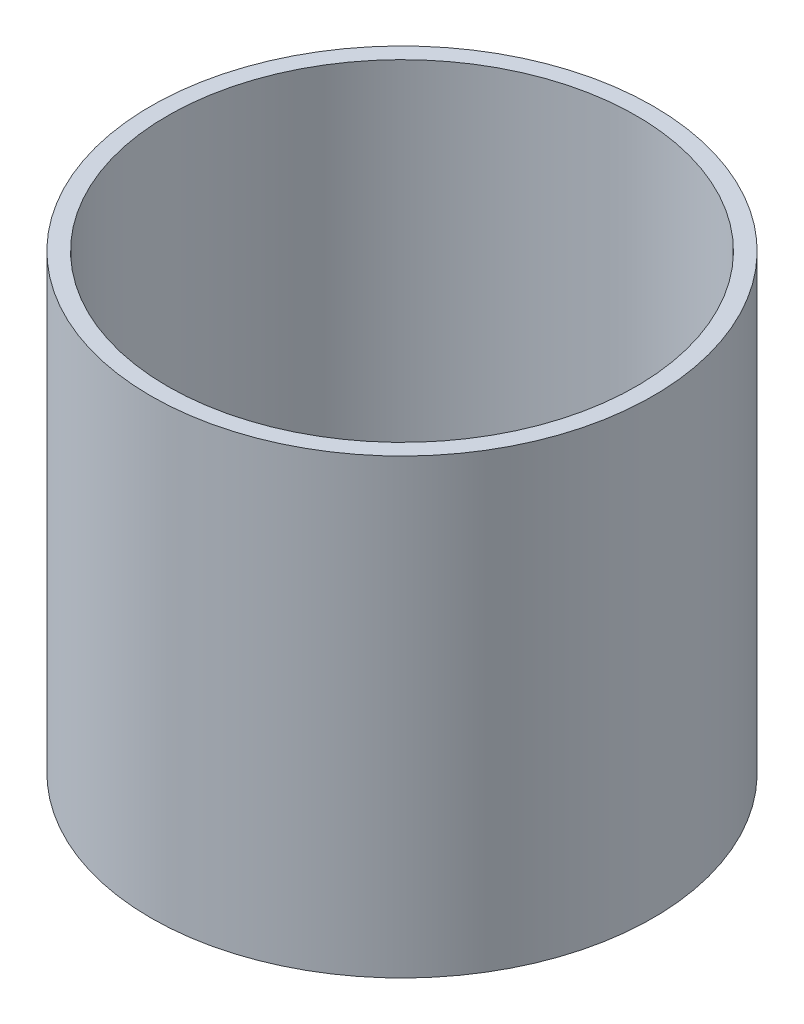
ISO-10303-21;
HEADER;
FILE_DESCRIPTION(('STEP AP214'),'2;1');
FILE_NAME('part.step','',(''),(''),'','','');
FILE_SCHEMA(('AUTOMOTIVE_DESIGN { 1 0 10303 214 1 1 1 1 }'));
ENDSEC;
DATA;
#1=APPLICATION_CONTEXT('core data for automotive mechanical design processes');
#2=APPLICATION_PROTOCOL_DEFINITION('international standard','automotive_design',2000,#1);
#3=PRODUCT_CONTEXT('',#1,'mechanical');
#4=PRODUCT('Part','Part','',(#3));
#5=PRODUCT_RELATED_PRODUCT_CATEGORY('part','',(#4));
#6=PRODUCT_DEFINITION_FORMATION('','',#4);
#7=PRODUCT_DEFINITION_CONTEXT('part definition',#1,'design');
#8=PRODUCT_DEFINITION('design','',#6,#7);
#9=PRODUCT_DEFINITION_SHAPE('','',#8);
#10=(LENGTH_UNIT() NAMED_UNIT(*) SI_UNIT(.MILLI.,.METRE.));
#11=(NAMED_UNIT(*) PLANE_ANGLE_UNIT() SI_UNIT($,.RADIAN.));
#12=(NAMED_UNIT(*) SI_UNIT($,.STERADIAN.) SOLID_ANGLE_UNIT());
#13=UNCERTAINTY_MEASURE_WITH_UNIT(LENGTH_MEASURE(1.E-05),#10,'distance_accuracy_value','');
#14=(GEOMETRIC_REPRESENTATION_CONTEXT(3) GLOBAL_UNCERTAINTY_ASSIGNED_CONTEXT((#13)) GLOBAL_UNIT_ASSIGNED_CONTEXT((#10,
#11,#12)) REPRESENTATION_CONTEXT('',''));
#15=CARTESIAN_POINT('',(0.,0.,0.));
#16=DIRECTION('',(0.,0.,1.));
#17=DIRECTION('',(1.,0.,0.));
#18=AXIS2_PLACEMENT_3D('',#15,#16,#17);
#19=CARTESIAN_POINT('',(0.,35.5,0.));
#20=DIRECTION('',(0.,1.,0.));
#21=DIRECTION('',(0.,0.,1.));
#22=AXIS2_PLACEMENT_3D('',#19,#20,#21);
#23=PLANE('',#22);
#24=CARTESIAN_POINT('',(0.,35.5,0.));
#25=DIRECTION('',(0.,1.,0.));
#26=DIRECTION('',(0.,0.,1.));
#27=AXIS2_PLACEMENT_3D('',#24,#25,#26);
#28=CIRCLE('',#27,22.5);
#29=CARTESIAN_POINT('',(0.,35.5,22.5));
#30=VERTEX_POINT('',#29);
#31=EDGE_CURVE('E10',#30,#30,#28,.T.);
#32=ORIENTED_EDGE('',*,*,#31,.T.);
#33=EDGE_LOOP('',(#32));
#34=FACE_BOUND('',#33,.T.);
#35=CARTESIAN_POINT('',(0.,35.5,0.));
#36=DIRECTION('',(0.,1.,0.));
#37=DIRECTION('',(0.,0.,1.));
#38=AXIS2_PLACEMENT_3D('',#35,#36,#37);
#39=CIRCLE('',#38,21.);
#40=CARTESIAN_POINT('',(0.,35.5,21.));
#41=VERTEX_POINT('',#40);
#42=EDGE_CURVE('E37',#41,#41,#39,.T.);
#43=ORIENTED_EDGE('',*,*,#42,.F.);
#44=EDGE_LOOP('',(#43));
#45=FACE_BOUND('',#44,.T.);
#46=ADVANCED_FACE('F30',(#34,#45),#23,.T.);
#47=CARTESIAN_POINT('',(0.,35.5,0.));
#48=DIRECTION('',(0.,-1.,0.));
#49=DIRECTION('',(0.,0.,-1.));
#50=AXIS2_PLACEMENT_3D('',#47,#48,#49);
#51=CYLINDRICAL_SURFACE('',#50,22.5);
#52=ORIENTED_EDGE('',*,*,#31,.F.);
#53=EDGE_LOOP('',(#52));
#54=FACE_BOUND('',#53,.T.);
#55=CARTESIAN_POINT('',(0.,-5.,0.));
#56=DIRECTION('',(0.,-1.,0.));
#57=DIRECTION('',(0.,0.,-1.));
#58=AXIS2_PLACEMENT_3D('',#55,#56,#57);
#59=CIRCLE('',#58,22.5);
#60=CARTESIAN_POINT('',(0.,-5.,-22.5));
#61=VERTEX_POINT('',#60);
#62=EDGE_CURVE('E46',#61,#61,#59,.T.);
#63=ORIENTED_EDGE('',*,*,#62,.F.);
#64=EDGE_LOOP('',(#63));
#65=FACE_BOUND('',#64,.T.);
#66=ADVANCED_FACE('F32',(#54,#65),#51,.T.);
#67=CARTESIAN_POINT('',(0.,35.5,0.));
#68=DIRECTION('',(0.,-1.,0.));
#69=DIRECTION('',(0.,0.,-1.));
#70=AXIS2_PLACEMENT_3D('',#67,#68,#69);
#71=CYLINDRICAL_SURFACE('',#70,21.);
#72=ORIENTED_EDGE('',*,*,#42,.T.);
#73=EDGE_LOOP('',(#72));
#74=FACE_BOUND('',#73,.T.);
#75=CARTESIAN_POINT('',(0.,0.,0.));
#76=DIRECTION('',(0.,1.,0.));
#77=DIRECTION('',(0.,0.,1.));
#78=AXIS2_PLACEMENT_3D('',#75,#76,#77);
#79=CIRCLE('',#78,21.);
#80=CARTESIAN_POINT('',(0.,0.,21.));
#81=VERTEX_POINT('',#80);
#82=EDGE_CURVE('E41',#81,#81,#79,.T.);
#83=ORIENTED_EDGE('',*,*,#82,.F.);
#84=EDGE_LOOP('',(#83));
#85=FACE_BOUND('',#84,.T.);
#86=ADVANCED_FACE('F54',(#74,#85),#71,.F.);
#87=CARTESIAN_POINT('',(0.,0.,0.));
#88=DIRECTION('',(0.,-1.,0.));
#89=DIRECTION('',(0.,0.,-1.));
#90=AXIS2_PLACEMENT_3D('',#87,#88,#89);
#91=PLANE('',#90);
#92=ORIENTED_EDGE('',*,*,#82,.T.);
#93=EDGE_LOOP('',(#92));
#94=FACE_BOUND('',#93,.T.);
#95=ADVANCED_FACE('F60',(#94),#91,.F.);
#96=CARTESIAN_POINT('',(0.,-5.,0.));
#97=DIRECTION('',(0.,-1.,0.));
#98=DIRECTION('',(0.,0.,-1.));
#99=AXIS2_PLACEMENT_3D('',#96,#97,#98);
#100=PLANE('',#99);
#101=ORIENTED_EDGE('',*,*,#62,.T.);
#102=EDGE_LOOP('',(#101));
#103=FACE_BOUND('',#102,.T.);
#104=ADVANCED_FACE('F51',(#103),#100,.T.);
#105=CLOSED_SHELL('',(#46,#66,#86,#95,#104));
#106=MANIFOLD_SOLID_BREP('B2',#105);
#107=ADVANCED_BREP_SHAPE_REPRESENTATION('',(#18,#106),#14);
#108=SHAPE_DEFINITION_REPRESENTATION(#9,#107);
ENDSEC;
END-ISO-10303-21;
